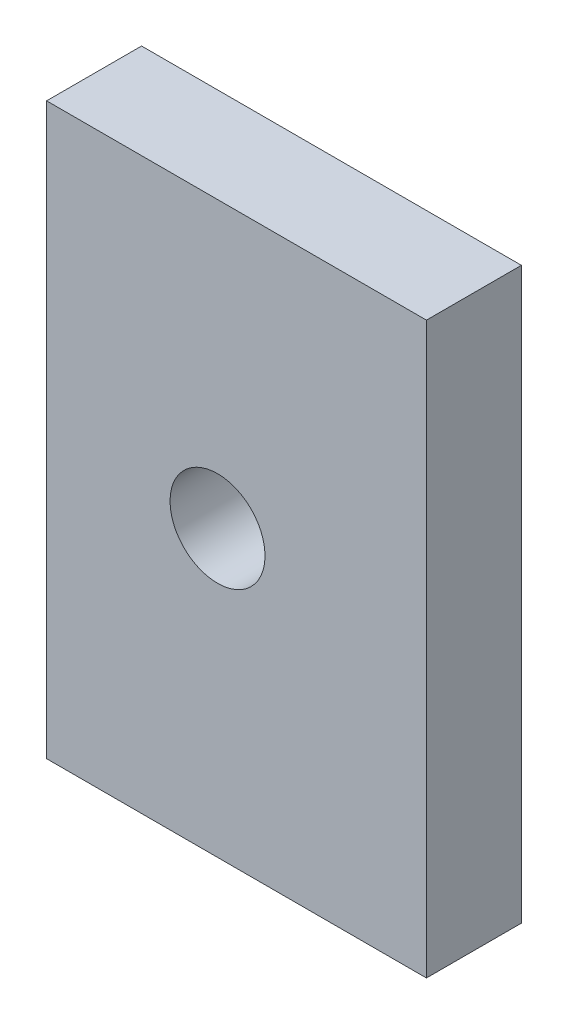
ISO-10303-21;
HEADER;
FILE_DESCRIPTION(('STEP AP214'),'2;1');
FILE_NAME('part.step','',(''),(''),'','','');
FILE_SCHEMA(('AUTOMOTIVE_DESIGN { 1 0 10303 214 1 1 1 1 }'));
ENDSEC;
DATA;
#1=APPLICATION_CONTEXT('core data for automotive mechanical design processes');
#2=APPLICATION_PROTOCOL_DEFINITION('international standard','automotive_design',2000,#1);
#3=PRODUCT_CONTEXT('',#1,'mechanical');
#4=PRODUCT('Part','Part','',(#3));
#5=PRODUCT_RELATED_PRODUCT_CATEGORY('part','',(#4));
#6=PRODUCT_DEFINITION_FORMATION('','',#4);
#7=PRODUCT_DEFINITION_CONTEXT('part definition',#1,'design');
#8=PRODUCT_DEFINITION('design','',#6,#7);
#9=PRODUCT_DEFINITION_SHAPE('','',#8);
#10=(LENGTH_UNIT() NAMED_UNIT(*) SI_UNIT(.MILLI.,.METRE.));
#11=(NAMED_UNIT(*) PLANE_ANGLE_UNIT() SI_UNIT($,.RADIAN.));
#12=(NAMED_UNIT(*) SI_UNIT($,.STERADIAN.) SOLID_ANGLE_UNIT());
#13=UNCERTAINTY_MEASURE_WITH_UNIT(LENGTH_MEASURE(1.E-05),#10,'distance_accuracy_value','');
#14=(GEOMETRIC_REPRESENTATION_CONTEXT(3) GLOBAL_UNCERTAINTY_ASSIGNED_CONTEXT((#13)) GLOBAL_UNIT_ASSIGNED_CONTEXT((#10,
#11,#12)) REPRESENTATION_CONTEXT('',''));
#15=CARTESIAN_POINT('',(0.,0.,0.));
#16=DIRECTION('',(0.,0.,1.));
#17=DIRECTION('',(1.,0.,0.));
#18=AXIS2_PLACEMENT_3D('',#15,#16,#17);
#19=CARTESIAN_POINT('',(10.,-15.,5.));
#20=DIRECTION('',(-1.,0.,0.));
#21=DIRECTION('',(0.,0.,1.));
#22=AXIS2_PLACEMENT_3D('',#19,#20,#21);
#23=PLANE('',#22);
#24=DIRECTION('',(0.,1.,0.));
#25=VECTOR('',#24,1.);
#26=CARTESIAN_POINT('',(10.,-15.,0.));
#27=LINE('',#26,#25);
#28=CARTESIAN_POINT('',(10.,-15.,0.));
#29=VERTEX_POINT('',#28);
#30=CARTESIAN_POINT('',(10.,15.,0.));
#31=VERTEX_POINT('',#30);
#32=EDGE_CURVE('E113',#29,#31,#27,.T.);
#33=ORIENTED_EDGE('',*,*,#32,.T.);
#34=DIRECTION('',(0.,0.,-1.));
#35=VECTOR('',#34,1.);
#36=CARTESIAN_POINT('',(10.,15.,5.));
#37=LINE('',#36,#35);
#38=CARTESIAN_POINT('',(10.,15.,5.));
#39=VERTEX_POINT('',#38);
#40=EDGE_CURVE('E11',#39,#31,#37,.T.);
#41=ORIENTED_EDGE('',*,*,#40,.F.);
#42=DIRECTION('',(0.,1.,0.));
#43=VECTOR('',#42,1.);
#44=CARTESIAN_POINT('',(10.,-15.,5.));
#45=LINE('',#44,#43);
#46=CARTESIAN_POINT('',(10.,-15.,5.));
#47=VERTEX_POINT('',#46);
#48=EDGE_CURVE('E96',#47,#39,#45,.T.);
#49=ORIENTED_EDGE('',*,*,#48,.F.);
#50=DIRECTION('',(0.,0.,-1.));
#51=VECTOR('',#50,1.);
#52=CARTESIAN_POINT('',(10.,-15.,5.));
#53=LINE('',#52,#51);
#54=EDGE_CURVE('E109',#47,#29,#53,.T.);
#55=ORIENTED_EDGE('',*,*,#54,.T.);
#56=EDGE_LOOP('',(#33,#41,#49,#55));
#57=FACE_BOUND('',#56,.T.);
#58=ADVANCED_FACE('F43',(#57),#23,.F.);
#59=CARTESIAN_POINT('',(-10.,15.,5.));
#60=DIRECTION('',(0.,-1.,0.));
#61=DIRECTION('',(0.,0.,-1.));
#62=AXIS2_PLACEMENT_3D('',#59,#60,#61);
#63=PLANE('',#62);
#64=DIRECTION('',(-1.,0.,0.));
#65=VECTOR('',#64,1.);
#66=CARTESIAN_POINT('',(-10.,15.,0.));
#67=LINE('',#66,#65);
#68=CARTESIAN_POINT('',(-10.,15.,0.));
#69=VERTEX_POINT('',#68);
#70=EDGE_CURVE('E101',#31,#69,#67,.T.);
#71=ORIENTED_EDGE('',*,*,#70,.T.);
#72=DIRECTION('',(0.,0.,-1.));
#73=VECTOR('',#72,1.);
#74=CARTESIAN_POINT('',(-10.,15.,5.));
#75=LINE('',#74,#73);
#76=CARTESIAN_POINT('',(-10.,15.,5.));
#77=VERTEX_POINT('',#76);
#78=EDGE_CURVE('E53',#77,#69,#75,.T.);
#79=ORIENTED_EDGE('',*,*,#78,.F.);
#80=DIRECTION('',(-1.,0.,0.));
#81=VECTOR('',#80,1.);
#82=CARTESIAN_POINT('',(-10.,15.,5.));
#83=LINE('',#82,#81);
#84=EDGE_CURVE('E91',#39,#77,#83,.T.);
#85=ORIENTED_EDGE('',*,*,#84,.F.);
#86=ORIENTED_EDGE('',*,*,#40,.T.);
#87=EDGE_LOOP('',(#71,#79,#85,#86));
#88=FACE_BOUND('',#87,.T.);
#89=ADVANCED_FACE('F100',(#88),#63,.F.);
#90=CARTESIAN_POINT('',(-10.,-15.,5.));
#91=DIRECTION('',(1.,0.,0.));
#92=DIRECTION('',(0.,0.,-1.));
#93=AXIS2_PLACEMENT_3D('',#90,#91,#92);
#94=PLANE('',#93);
#95=DIRECTION('',(0.,-1.,0.));
#96=VECTOR('',#95,1.);
#97=CARTESIAN_POINT('',(-10.,-15.,0.));
#98=LINE('',#97,#96);
#99=CARTESIAN_POINT('',(-10.,-15.,0.));
#100=VERTEX_POINT('',#99);
#101=EDGE_CURVE('E78',#69,#100,#98,.T.);
#102=ORIENTED_EDGE('',*,*,#101,.T.);
#103=DIRECTION('',(0.,0.,-1.));
#104=VECTOR('',#103,1.);
#105=CARTESIAN_POINT('',(-10.,-15.,5.));
#106=LINE('',#105,#104);
#107=CARTESIAN_POINT('',(-10.,-15.,5.));
#108=VERTEX_POINT('',#107);
#109=EDGE_CURVE('E103',#108,#100,#106,.T.);
#110=ORIENTED_EDGE('',*,*,#109,.F.);
#111=DIRECTION('',(0.,-1.,0.));
#112=VECTOR('',#111,1.);
#113=CARTESIAN_POINT('',(-10.,-15.,5.));
#114=LINE('',#113,#112);
#115=EDGE_CURVE('E94',#77,#108,#114,.T.);
#116=ORIENTED_EDGE('',*,*,#115,.F.);
#117=ORIENTED_EDGE('',*,*,#78,.T.);
#118=EDGE_LOOP('',(#102,#110,#116,#117));
#119=FACE_BOUND('',#118,.T.);
#120=ADVANCED_FACE('F105',(#119),#94,.F.);
#121=CARTESIAN_POINT('',(-10.,-15.,5.));
#122=DIRECTION('',(0.,1.,0.));
#123=DIRECTION('',(0.,0.,1.));
#124=AXIS2_PLACEMENT_3D('',#121,#122,#123);
#125=PLANE('',#124);
#126=DIRECTION('',(1.,0.,0.));
#127=VECTOR('',#126,1.);
#128=CARTESIAN_POINT('',(-10.,-15.,0.));
#129=LINE('',#128,#127);
#130=EDGE_CURVE('E84',#100,#29,#129,.T.);
#131=ORIENTED_EDGE('',*,*,#130,.T.);
#132=ORIENTED_EDGE('',*,*,#54,.F.);
#133=DIRECTION('',(1.,0.,0.));
#134=VECTOR('',#133,1.);
#135=CARTESIAN_POINT('',(-10.,-15.,5.));
#136=LINE('',#135,#134);
#137=EDGE_CURVE('E61',#108,#47,#136,.T.);
#138=ORIENTED_EDGE('',*,*,#137,.F.);
#139=ORIENTED_EDGE('',*,*,#109,.T.);
#140=EDGE_LOOP('',(#131,#132,#138,#139));
#141=FACE_BOUND('',#140,.T.);
#142=ADVANCED_FACE('F127',(#141),#125,.F.);
#143=CARTESIAN_POINT('',(0.,0.,5.));
#144=DIRECTION('',(0.,0.,-1.));
#145=DIRECTION('',(-1.,0.,0.));
#146=AXIS2_PLACEMENT_3D('',#143,#144,#145);
#147=PLANE('',#146);
#148=CARTESIAN_POINT('',(-1.,0.,5.));
#149=DIRECTION('',(0.,0.,-1.));
#150=DIRECTION('',(-1.,0.,0.));
#151=AXIS2_PLACEMENT_3D('',#148,#149,#150);
#152=CIRCLE('',#151,2.5);
#153=CARTESIAN_POINT('',(-3.5,0.,5.));
#154=VERTEX_POINT('',#153);
#155=EDGE_CURVE('E117',#154,#154,#152,.F.);
#156=ORIENTED_EDGE('',*,*,#155,.F.);
#157=EDGE_LOOP('',(#156));
#158=FACE_BOUND('',#157,.T.);
#159=ORIENTED_EDGE('',*,*,#48,.T.);
#160=ORIENTED_EDGE('',*,*,#84,.T.);
#161=ORIENTED_EDGE('',*,*,#115,.T.);
#162=ORIENTED_EDGE('',*,*,#137,.T.);
#163=EDGE_LOOP('',(#159,#160,#161,#162));
#164=FACE_BOUND('',#163,.T.);
#165=ADVANCED_FACE('F92',(#158,#164),#147,.F.);
#166=CARTESIAN_POINT('',(0.,0.,0.));
#167=DIRECTION('',(0.,0.,-1.));
#168=DIRECTION('',(-1.,0.,0.));
#169=AXIS2_PLACEMENT_3D('',#166,#167,#168);
#170=PLANE('',#169);
#171=CARTESIAN_POINT('',(-1.,0.,0.));
#172=DIRECTION('',(0.,0.,-1.));
#173=DIRECTION('',(-1.,0.,0.));
#174=AXIS2_PLACEMENT_3D('',#171,#172,#173);
#175=CIRCLE('',#174,2.5);
#176=CARTESIAN_POINT('',(-3.5,0.,0.));
#177=VERTEX_POINT('',#176);
#178=EDGE_CURVE('E46',#177,#177,#175,.F.);
#179=ORIENTED_EDGE('',*,*,#178,.T.);
#180=EDGE_LOOP('',(#179));
#181=FACE_BOUND('',#180,.T.);
#182=ORIENTED_EDGE('',*,*,#32,.F.);
#183=ORIENTED_EDGE('',*,*,#130,.F.);
#184=ORIENTED_EDGE('',*,*,#101,.F.);
#185=ORIENTED_EDGE('',*,*,#70,.F.);
#186=EDGE_LOOP('',(#182,#183,#184,#185));
#187=FACE_BOUND('',#186,.T.);
#188=ADVANCED_FACE('F130',(#181,#187),#170,.T.);
#189=CARTESIAN_POINT('',(-1.,0.,17.));
#190=DIRECTION('',(0.,0.,-1.));
#191=DIRECTION('',(-1.,0.,0.));
#192=AXIS2_PLACEMENT_3D('',#189,#190,#191);
#193=CYLINDRICAL_SURFACE('',#192,2.5);
#194=ORIENTED_EDGE('',*,*,#178,.F.);
#195=EDGE_LOOP('',(#194));
#196=FACE_BOUND('',#195,.T.);
#197=ORIENTED_EDGE('',*,*,#155,.T.);
#198=EDGE_LOOP('',(#197));
#199=FACE_BOUND('',#198,.T.);
#200=ADVANCED_FACE('F143',(#196,#199),#193,.F.);
#201=CLOSED_SHELL('',(#58,#89,#120,#142,#165,#188,#200));
#202=MANIFOLD_SOLID_BREP('B2',#201);
#203=ADVANCED_BREP_SHAPE_REPRESENTATION('',(#18,#202),#14);
#204=SHAPE_DEFINITION_REPRESENTATION(#9,#203);
ENDSEC;
END-ISO-10303-21;
